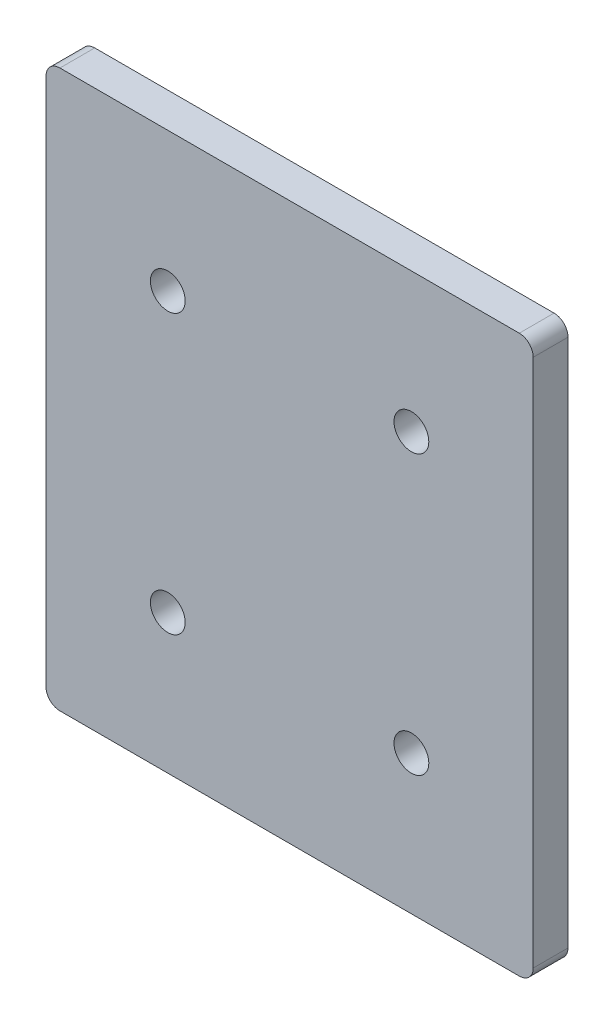
ISO-10303-21;
HEADER;
FILE_DESCRIPTION(('STEP AP214'),'2;1');
FILE_NAME('part.step','',(''),(''),'','','');
FILE_SCHEMA(('AUTOMOTIVE_DESIGN { 1 0 10303 214 1 1 1 1 }'));
ENDSEC;
DATA;
#1=APPLICATION_CONTEXT('core data for automotive mechanical design processes');
#2=APPLICATION_PROTOCOL_DEFINITION('international standard','automotive_design',2000,#1);
#3=PRODUCT_CONTEXT('',#1,'mechanical');
#4=PRODUCT('Part','Part','',(#3));
#5=PRODUCT_RELATED_PRODUCT_CATEGORY('part','',(#4));
#6=PRODUCT_DEFINITION_FORMATION('','',#4);
#7=PRODUCT_DEFINITION_CONTEXT('part definition',#1,'design');
#8=PRODUCT_DEFINITION('design','',#6,#7);
#9=PRODUCT_DEFINITION_SHAPE('','',#8);
#10=(LENGTH_UNIT() NAMED_UNIT(*) SI_UNIT(.MILLI.,.METRE.));
#11=(NAMED_UNIT(*) PLANE_ANGLE_UNIT() SI_UNIT($,.RADIAN.));
#12=(NAMED_UNIT(*) SI_UNIT($,.STERADIAN.) SOLID_ANGLE_UNIT());
#13=UNCERTAINTY_MEASURE_WITH_UNIT(LENGTH_MEASURE(1.E-05),#10,'distance_accuracy_value','');
#14=(GEOMETRIC_REPRESENTATION_CONTEXT(3) GLOBAL_UNCERTAINTY_ASSIGNED_CONTEXT((#13)) GLOBAL_UNIT_ASSIGNED_CONTEXT((#10,
#11,#12)) REPRESENTATION_CONTEXT('',''));
#15=CARTESIAN_POINT('',(0.,0.,0.));
#16=DIRECTION('',(0.,0.,1.));
#17=DIRECTION('',(1.,0.,0.));
#18=AXIS2_PLACEMENT_3D('',#15,#16,#17);
#19=CARTESIAN_POINT('',(0.,0.,5.));
#20=DIRECTION('',(0.,0.,1.));
#21=DIRECTION('',(1.,0.,0.));
#22=AXIS2_PLACEMENT_3D('',#19,#20,#21);
#23=PLANE('',#22);
#24=CARTESIAN_POINT('',(17.5000000000004,-20.,5.));
#25=DIRECTION('',(0.,0.,1.));
#26=DIRECTION('',(1.,0.,0.));
#27=AXIS2_PLACEMENT_3D('',#24,#25,#26);
#28=CIRCLE('',#27,2.5);
#29=CARTESIAN_POINT('',(20.0000000000004,-20.,5.));
#30=VERTEX_POINT('',#29);
#31=EDGE_CURVE('E183',#30,#30,#28,.T.);
#32=ORIENTED_EDGE('',*,*,#31,.F.);
#33=EDGE_LOOP('',(#32));
#34=FACE_BOUND('',#33,.T.);
#35=CARTESIAN_POINT('',(-17.5,20.,5.));
#36=DIRECTION('',(0.,0.,1.));
#37=DIRECTION('',(1.,0.,0.));
#38=AXIS2_PLACEMENT_3D('',#35,#36,#37);
#39=CIRCLE('',#38,2.5);
#40=CARTESIAN_POINT('',(-15.,20.,5.));
#41=VERTEX_POINT('',#40);
#42=EDGE_CURVE('E166',#41,#41,#39,.T.);
#43=ORIENTED_EDGE('',*,*,#42,.F.);
#44=EDGE_LOOP('',(#43));
#45=FACE_BOUND('',#44,.T.);
#46=DIRECTION('',(0.,-1.,0.));
#47=VECTOR('',#46,1.);
#48=CARTESIAN_POINT('',(-35.,40.,5.));
#49=LINE('',#48,#47);
#50=CARTESIAN_POINT('',(-35.,38.,5.));
#51=VERTEX_POINT('',#50);
#52=CARTESIAN_POINT('',(-35.,-38.,5.));
#53=VERTEX_POINT('',#52);
#54=EDGE_CURVE('E170',#51,#53,#49,.T.);
#55=ORIENTED_EDGE('',*,*,#54,.T.);
#56=CARTESIAN_POINT('',(-33.,-38.,5.));
#57=DIRECTION('',(0.,0.,1.));
#58=DIRECTION('',(1.,0.,0.));
#59=AXIS2_PLACEMENT_3D('',#56,#57,#58);
#60=CIRCLE('',#59,2.);
#61=CARTESIAN_POINT('',(-33.,-40.,5.));
#62=VERTEX_POINT('',#61);
#63=EDGE_CURVE('E153',#53,#62,#60,.T.);
#64=ORIENTED_EDGE('',*,*,#63,.T.);
#65=DIRECTION('',(1.,0.,0.));
#66=VECTOR('',#65,1.);
#67=CARTESIAN_POINT('',(-35.,-40.,5.));
#68=LINE('',#67,#66);
#69=CARTESIAN_POINT('',(33.,-40.,5.));
#70=VERTEX_POINT('',#69);
#71=EDGE_CURVE('E124',#62,#70,#68,.T.);
#72=ORIENTED_EDGE('',*,*,#71,.T.);
#73=CARTESIAN_POINT('',(33.,-38.,5.));
#74=DIRECTION('',(0.,0.,1.));
#75=DIRECTION('',(1.,0.,0.));
#76=AXIS2_PLACEMENT_3D('',#73,#74,#75);
#77=CIRCLE('',#76,2.);
#78=CARTESIAN_POINT('',(35.,-38.,5.));
#79=VERTEX_POINT('',#78);
#80=EDGE_CURVE('E151',#70,#79,#77,.T.);
#81=ORIENTED_EDGE('',*,*,#80,.T.);
#82=DIRECTION('',(0.,1.,0.));
#83=VECTOR('',#82,1.);
#84=CARTESIAN_POINT('',(35.,40.,5.));
#85=LINE('',#84,#83);
#86=CARTESIAN_POINT('',(35.,38.,5.));
#87=VERTEX_POINT('',#86);
#88=EDGE_CURVE('E131',#79,#87,#85,.T.);
#89=ORIENTED_EDGE('',*,*,#88,.T.);
#90=CARTESIAN_POINT('',(33.,38.,5.));
#91=DIRECTION('',(0.,0.,1.));
#92=DIRECTION('',(1.,0.,0.));
#93=AXIS2_PLACEMENT_3D('',#90,#91,#92);
#94=CIRCLE('',#93,2.);
#95=CARTESIAN_POINT('',(33.,40.,5.));
#96=VERTEX_POINT('',#95);
#97=EDGE_CURVE('E59',#87,#96,#94,.T.);
#98=ORIENTED_EDGE('',*,*,#97,.T.);
#99=DIRECTION('',(-1.,0.,0.));
#100=VECTOR('',#99,1.);
#101=CARTESIAN_POINT('',(-35.,40.,5.));
#102=LINE('',#101,#100);
#103=CARTESIAN_POINT('',(-33.,40.,5.));
#104=VERTEX_POINT('',#103);
#105=EDGE_CURVE('E134',#96,#104,#102,.T.);
#106=ORIENTED_EDGE('',*,*,#105,.T.);
#107=CARTESIAN_POINT('',(-33.,38.,5.));
#108=DIRECTION('',(0.,0.,1.));
#109=DIRECTION('',(1.,0.,0.));
#110=AXIS2_PLACEMENT_3D('',#107,#108,#109);
#111=CIRCLE('',#110,2.);
#112=EDGE_CURVE('E149',#104,#51,#111,.T.);
#113=ORIENTED_EDGE('',*,*,#112,.T.);
#114=EDGE_LOOP('',(#55,#64,#72,#81,#89,#98,#106,#113));
#115=FACE_BOUND('',#114,.T.);
#116=CARTESIAN_POINT('',(17.5,20.,5.));
#117=DIRECTION('',(0.,0.,1.));
#118=DIRECTION('',(1.,0.,0.));
#119=AXIS2_PLACEMENT_3D('',#116,#117,#118);
#120=CIRCLE('',#119,2.5);
#121=CARTESIAN_POINT('',(20.,20.,5.));
#122=VERTEX_POINT('',#121);
#123=EDGE_CURVE('E177',#122,#122,#120,.T.);
#124=ORIENTED_EDGE('',*,*,#123,.F.);
#125=EDGE_LOOP('',(#124));
#126=FACE_BOUND('',#125,.T.);
#127=CARTESIAN_POINT('',(-17.4999999999996,-20.,5.));
#128=DIRECTION('',(0.,0.,1.));
#129=DIRECTION('',(1.,0.,0.));
#130=AXIS2_PLACEMENT_3D('',#127,#128,#129);
#131=CIRCLE('',#130,2.5);
#132=CARTESIAN_POINT('',(-14.9999999999996,-20.,5.));
#133=VERTEX_POINT('',#132);
#134=EDGE_CURVE('E189',#133,#133,#131,.T.);
#135=ORIENTED_EDGE('',*,*,#134,.F.);
#136=EDGE_LOOP('',(#135));
#137=FACE_BOUND('',#136,.T.);
#138=ADVANCED_FACE('F39',(#34,#45,#115,#126,#137),#23,.T.);
#139=CARTESIAN_POINT('',(0.,0.,0.));
#140=DIRECTION('',(0.,0.,1.));
#141=DIRECTION('',(1.,0.,0.));
#142=AXIS2_PLACEMENT_3D('',#139,#140,#141);
#143=PLANE('',#142);
#144=DIRECTION('',(1.,0.,0.));
#145=VECTOR('',#144,1.);
#146=CARTESIAN_POINT('',(-35.,-40.,0.));
#147=LINE('',#146,#145);
#148=CARTESIAN_POINT('',(-33.,-40.,0.));
#149=VERTEX_POINT('',#148);
#150=CARTESIAN_POINT('',(33.,-40.,0.));
#151=VERTEX_POINT('',#150);
#152=EDGE_CURVE('E121',#149,#151,#147,.T.);
#153=ORIENTED_EDGE('',*,*,#152,.F.);
#154=CARTESIAN_POINT('',(-33.,-38.,0.));
#155=DIRECTION('',(0.,0.,1.));
#156=DIRECTION('',(1.,0.,0.));
#157=AXIS2_PLACEMENT_3D('',#154,#155,#156);
#158=CIRCLE('',#157,2.);
#159=CARTESIAN_POINT('',(-35.,-38.,0.));
#160=VERTEX_POINT('',#159);
#161=EDGE_CURVE('E104',#149,#160,#158,.F.);
#162=ORIENTED_EDGE('',*,*,#161,.T.);
#163=DIRECTION('',(0.,-1.,0.));
#164=VECTOR('',#163,1.);
#165=CARTESIAN_POINT('',(-35.,40.,0.));
#166=LINE('',#165,#164);
#167=CARTESIAN_POINT('',(-35.,38.,0.));
#168=VERTEX_POINT('',#167);
#169=EDGE_CURVE('E132',#168,#160,#166,.T.);
#170=ORIENTED_EDGE('',*,*,#169,.F.);
#171=CARTESIAN_POINT('',(-33.,38.,0.));
#172=DIRECTION('',(0.,0.,1.));
#173=DIRECTION('',(1.,0.,0.));
#174=AXIS2_PLACEMENT_3D('',#171,#172,#173);
#175=CIRCLE('',#174,2.);
#176=CARTESIAN_POINT('',(-33.,40.,0.));
#177=VERTEX_POINT('',#176);
#178=EDGE_CURVE('E142',#168,#177,#175,.F.);
#179=ORIENTED_EDGE('',*,*,#178,.T.);
#180=DIRECTION('',(-1.,0.,0.));
#181=VECTOR('',#180,1.);
#182=CARTESIAN_POINT('',(-35.,40.,0.));
#183=LINE('',#182,#181);
#184=CARTESIAN_POINT('',(33.,40.,0.));
#185=VERTEX_POINT('',#184);
#186=EDGE_CURVE('E136',#185,#177,#183,.T.);
#187=ORIENTED_EDGE('',*,*,#186,.F.);
#188=CARTESIAN_POINT('',(33.,38.,0.));
#189=DIRECTION('',(0.,0.,1.));
#190=DIRECTION('',(1.,0.,0.));
#191=AXIS2_PLACEMENT_3D('',#188,#189,#190);
#192=CIRCLE('',#191,2.);
#193=CARTESIAN_POINT('',(35.,38.,0.));
#194=VERTEX_POINT('',#193);
#195=EDGE_CURVE('E125',#185,#194,#192,.F.);
#196=ORIENTED_EDGE('',*,*,#195,.T.);
#197=DIRECTION('',(0.,1.,0.));
#198=VECTOR('',#197,1.);
#199=CARTESIAN_POINT('',(35.,40.,0.));
#200=LINE('',#199,#198);
#201=CARTESIAN_POINT('',(35.,-38.,0.));
#202=VERTEX_POINT('',#201);
#203=EDGE_CURVE('E165',#202,#194,#200,.T.);
#204=ORIENTED_EDGE('',*,*,#203,.F.);
#205=CARTESIAN_POINT('',(33.,-38.,0.));
#206=DIRECTION('',(0.,0.,1.));
#207=DIRECTION('',(1.,0.,0.));
#208=AXIS2_PLACEMENT_3D('',#205,#206,#207);
#209=CIRCLE('',#208,2.);
#210=EDGE_CURVE('E115',#202,#151,#209,.F.);
#211=ORIENTED_EDGE('',*,*,#210,.T.);
#212=EDGE_LOOP('',(#153,#162,#170,#179,#187,#196,#204,#211));
#213=FACE_BOUND('',#212,.T.);
#214=CARTESIAN_POINT('',(-17.5,20.,0.));
#215=DIRECTION('',(0.,0.,1.));
#216=DIRECTION('',(1.,0.,0.));
#217=AXIS2_PLACEMENT_3D('',#214,#215,#216);
#218=CIRCLE('',#217,2.5);
#219=CARTESIAN_POINT('',(-15.,20.,0.));
#220=VERTEX_POINT('',#219);
#221=EDGE_CURVE('E174',#220,#220,#218,.T.);
#222=ORIENTED_EDGE('',*,*,#221,.T.);
#223=EDGE_LOOP('',(#222));
#224=FACE_BOUND('',#223,.T.);
#225=CARTESIAN_POINT('',(17.5,20.,0.));
#226=DIRECTION('',(0.,0.,1.));
#227=DIRECTION('',(1.,0.,0.));
#228=AXIS2_PLACEMENT_3D('',#225,#226,#227);
#229=CIRCLE('',#228,2.5);
#230=CARTESIAN_POINT('',(20.,20.,0.));
#231=VERTEX_POINT('',#230);
#232=EDGE_CURVE('E180',#231,#231,#229,.T.);
#233=ORIENTED_EDGE('',*,*,#232,.T.);
#234=EDGE_LOOP('',(#233));
#235=FACE_BOUND('',#234,.T.);
#236=CARTESIAN_POINT('',(17.5000000000004,-20.,0.));
#237=DIRECTION('',(0.,0.,1.));
#238=DIRECTION('',(1.,0.,0.));
#239=AXIS2_PLACEMENT_3D('',#236,#237,#238);
#240=CIRCLE('',#239,2.5);
#241=CARTESIAN_POINT('',(20.0000000000004,-20.,0.));
#242=VERTEX_POINT('',#241);
#243=EDGE_CURVE('E186',#242,#242,#240,.T.);
#244=ORIENTED_EDGE('',*,*,#243,.T.);
#245=EDGE_LOOP('',(#244));
#246=FACE_BOUND('',#245,.T.);
#247=CARTESIAN_POINT('',(-17.4999999999996,-20.,0.));
#248=DIRECTION('',(0.,0.,1.));
#249=DIRECTION('',(1.,0.,0.));
#250=AXIS2_PLACEMENT_3D('',#247,#248,#249);
#251=CIRCLE('',#250,2.5);
#252=CARTESIAN_POINT('',(-14.9999999999996,-20.,0.));
#253=VERTEX_POINT('',#252);
#254=EDGE_CURVE('E192',#253,#253,#251,.T.);
#255=ORIENTED_EDGE('',*,*,#254,.T.);
#256=EDGE_LOOP('',(#255));
#257=FACE_BOUND('',#256,.T.);
#258=ADVANCED_FACE('F128',(#213,#224,#235,#246,#257),#143,.F.);
#259=CARTESIAN_POINT('',(35.,40.,5.));
#260=DIRECTION('',(-1.,0.,0.));
#261=DIRECTION('',(0.,-1.,0.));
#262=AXIS2_PLACEMENT_3D('',#259,#260,#261);
#263=PLANE('',#262);
#264=ORIENTED_EDGE('',*,*,#88,.F.);
#265=DIRECTION('',(0.,0.,-1.));
#266=VECTOR('',#265,1.);
#267=CARTESIAN_POINT('',(35.,-38.,5.));
#268=LINE('',#267,#266);
#269=EDGE_CURVE('E157',#79,#202,#268,.T.);
#270=ORIENTED_EDGE('',*,*,#269,.T.);
#271=ORIENTED_EDGE('',*,*,#203,.T.);
#272=DIRECTION('',(0.,0.,-1.));
#273=VECTOR('',#272,1.);
#274=CARTESIAN_POINT('',(35.,38.,5.));
#275=LINE('',#274,#273);
#276=EDGE_CURVE('E155',#194,#87,#275,.F.);
#277=ORIENTED_EDGE('',*,*,#276,.T.);
#278=EDGE_LOOP('',(#264,#270,#271,#277));
#279=FACE_BOUND('',#278,.T.);
#280=ADVANCED_FACE('F207',(#279),#263,.F.);
#281=CARTESIAN_POINT('',(-35.,40.,5.));
#282=DIRECTION('',(0.,-1.,0.));
#283=DIRECTION('',(0.,0.,-1.));
#284=AXIS2_PLACEMENT_3D('',#281,#282,#283);
#285=PLANE('',#284);
#286=ORIENTED_EDGE('',*,*,#186,.T.);
#287=DIRECTION('',(0.,0.,-1.));
#288=VECTOR('',#287,1.);
#289=CARTESIAN_POINT('',(-33.,40.,5.));
#290=LINE('',#289,#288);
#291=EDGE_CURVE('E11',#177,#104,#290,.F.);
#292=ORIENTED_EDGE('',*,*,#291,.T.);
#293=ORIENTED_EDGE('',*,*,#105,.F.);
#294=DIRECTION('',(0.,0.,-1.));
#295=VECTOR('',#294,1.);
#296=CARTESIAN_POINT('',(33.,40.,5.));
#297=LINE('',#296,#295);
#298=EDGE_CURVE('E47',#96,#185,#297,.T.);
#299=ORIENTED_EDGE('',*,*,#298,.T.);
#300=EDGE_LOOP('',(#286,#292,#293,#299));
#301=FACE_BOUND('',#300,.T.);
#302=ADVANCED_FACE('F162',(#301),#285,.F.);
#303=CARTESIAN_POINT('',(-35.,40.,5.));
#304=DIRECTION('',(1.,0.,0.));
#305=DIRECTION('',(0.,1.,0.));
#306=AXIS2_PLACEMENT_3D('',#303,#304,#305);
#307=PLANE('',#306);
#308=ORIENTED_EDGE('',*,*,#169,.T.);
#309=DIRECTION('',(0.,0.,-1.));
#310=VECTOR('',#309,1.);
#311=CARTESIAN_POINT('',(-35.,-38.,5.));
#312=LINE('',#311,#310);
#313=EDGE_CURVE('E109',#160,#53,#312,.F.);
#314=ORIENTED_EDGE('',*,*,#313,.T.);
#315=ORIENTED_EDGE('',*,*,#54,.F.);
#316=DIRECTION('',(0.,0.,-1.));
#317=VECTOR('',#316,1.);
#318=CARTESIAN_POINT('',(-35.,38.,5.));
#319=LINE('',#318,#317);
#320=EDGE_CURVE('E114',#51,#168,#319,.T.);
#321=ORIENTED_EDGE('',*,*,#320,.T.);
#322=EDGE_LOOP('',(#308,#314,#315,#321));
#323=FACE_BOUND('',#322,.T.);
#324=ADVANCED_FACE('F217',(#323),#307,.F.);
#325=CARTESIAN_POINT('',(-35.,-40.,5.));
#326=DIRECTION('',(0.,1.,0.));
#327=DIRECTION('',(0.,0.,1.));
#328=AXIS2_PLACEMENT_3D('',#325,#326,#327);
#329=PLANE('',#328);
#330=ORIENTED_EDGE('',*,*,#71,.F.);
#331=DIRECTION('',(0.,0.,-1.));
#332=VECTOR('',#331,1.);
#333=CARTESIAN_POINT('',(-33.,-40.,5.));
#334=LINE('',#333,#332);
#335=EDGE_CURVE('E108',#62,#149,#334,.T.);
#336=ORIENTED_EDGE('',*,*,#335,.T.);
#337=ORIENTED_EDGE('',*,*,#152,.T.);
#338=DIRECTION('',(0.,0.,-1.));
#339=VECTOR('',#338,1.);
#340=CARTESIAN_POINT('',(33.,-40.,5.));
#341=LINE('',#340,#339);
#342=EDGE_CURVE('E126',#151,#70,#341,.F.);
#343=ORIENTED_EDGE('',*,*,#342,.T.);
#344=EDGE_LOOP('',(#330,#336,#337,#343));
#345=FACE_BOUND('',#344,.T.);
#346=ADVANCED_FACE('F120',(#345),#329,.F.);
#347=CARTESIAN_POINT('',(-17.5,20.,5.));
#348=DIRECTION('',(0.,0.,-1.));
#349=DIRECTION('',(-1.,0.,0.));
#350=AXIS2_PLACEMENT_3D('',#347,#348,#349);
#351=CYLINDRICAL_SURFACE('',#350,2.5);
#352=ORIENTED_EDGE('',*,*,#42,.T.);
#353=EDGE_LOOP('',(#352));
#354=FACE_BOUND('',#353,.T.);
#355=ORIENTED_EDGE('',*,*,#221,.F.);
#356=EDGE_LOOP('',(#355));
#357=FACE_BOUND('',#356,.T.);
#358=ADVANCED_FACE('F212',(#354,#357),#351,.F.);
#359=CARTESIAN_POINT('',(17.5,20.,5.));
#360=DIRECTION('',(0.,0.,-1.));
#361=DIRECTION('',(-1.,0.,0.));
#362=AXIS2_PLACEMENT_3D('',#359,#360,#361);
#363=CYLINDRICAL_SURFACE('',#362,2.5);
#364=ORIENTED_EDGE('',*,*,#123,.T.);
#365=EDGE_LOOP('',(#364));
#366=FACE_BOUND('',#365,.T.);
#367=ORIENTED_EDGE('',*,*,#232,.F.);
#368=EDGE_LOOP('',(#367));
#369=FACE_BOUND('',#368,.T.);
#370=ADVANCED_FACE('F247',(#366,#369),#363,.F.);
#371=CARTESIAN_POINT('',(17.5000000000004,-20.,5.));
#372=DIRECTION('',(0.,0.,-1.));
#373=DIRECTION('',(-1.,0.,0.));
#374=AXIS2_PLACEMENT_3D('',#371,#372,#373);
#375=CYLINDRICAL_SURFACE('',#374,2.5);
#376=ORIENTED_EDGE('',*,*,#31,.T.);
#377=EDGE_LOOP('',(#376));
#378=FACE_BOUND('',#377,.T.);
#379=ORIENTED_EDGE('',*,*,#243,.F.);
#380=EDGE_LOOP('',(#379));
#381=FACE_BOUND('',#380,.T.);
#382=ADVANCED_FACE('F250',(#378,#381),#375,.F.);
#383=CARTESIAN_POINT('',(-17.4999999999996,-20.,5.));
#384=DIRECTION('',(0.,0.,-1.));
#385=DIRECTION('',(-1.,0.,0.));
#386=AXIS2_PLACEMENT_3D('',#383,#384,#385);
#387=CYLINDRICAL_SURFACE('',#386,2.5);
#388=ORIENTED_EDGE('',*,*,#134,.T.);
#389=EDGE_LOOP('',(#388));
#390=FACE_BOUND('',#389,.T.);
#391=ORIENTED_EDGE('',*,*,#254,.F.);
#392=EDGE_LOOP('',(#391));
#393=FACE_BOUND('',#392,.T.);
#394=ADVANCED_FACE('F198',(#390,#393),#387,.F.);
#395=CARTESIAN_POINT('',(-33.,-38.,5.));
#396=DIRECTION('',(0.,0.,-1.));
#397=DIRECTION('',(-1.,0.,0.));
#398=AXIS2_PLACEMENT_3D('',#395,#396,#397);
#399=CYLINDRICAL_SURFACE('',#398,2.);
#400=ORIENTED_EDGE('',*,*,#63,.F.);
#401=ORIENTED_EDGE('',*,*,#313,.F.);
#402=ORIENTED_EDGE('',*,*,#161,.F.);
#403=ORIENTED_EDGE('',*,*,#335,.F.);
#404=EDGE_LOOP('',(#400,#401,#402,#403));
#405=FACE_BOUND('',#404,.T.);
#406=ADVANCED_FACE('F107',(#405),#399,.T.);
#407=CARTESIAN_POINT('',(33.,-38.,5.));
#408=DIRECTION('',(0.,0.,-1.));
#409=DIRECTION('',(-1.,0.,0.));
#410=AXIS2_PLACEMENT_3D('',#407,#408,#409);
#411=CYLINDRICAL_SURFACE('',#410,2.);
#412=ORIENTED_EDGE('',*,*,#80,.F.);
#413=ORIENTED_EDGE('',*,*,#342,.F.);
#414=ORIENTED_EDGE('',*,*,#210,.F.);
#415=ORIENTED_EDGE('',*,*,#269,.F.);
#416=EDGE_LOOP('',(#412,#413,#414,#415));
#417=FACE_BOUND('',#416,.T.);
#418=ADVANCED_FACE('F228',(#417),#411,.T.);
#419=CARTESIAN_POINT('',(-33.,38.,5.));
#420=DIRECTION('',(0.,0.,-1.));
#421=DIRECTION('',(-1.,0.,0.));
#422=AXIS2_PLACEMENT_3D('',#419,#420,#421);
#423=CYLINDRICAL_SURFACE('',#422,2.);
#424=ORIENTED_EDGE('',*,*,#112,.F.);
#425=ORIENTED_EDGE('',*,*,#291,.F.);
#426=ORIENTED_EDGE('',*,*,#178,.F.);
#427=ORIENTED_EDGE('',*,*,#320,.F.);
#428=EDGE_LOOP('',(#424,#425,#426,#427));
#429=FACE_BOUND('',#428,.T.);
#430=ADVANCED_FACE('F230',(#429),#423,.T.);
#431=CARTESIAN_POINT('',(33.,38.,5.));
#432=DIRECTION('',(0.,0.,-1.));
#433=DIRECTION('',(-1.,0.,0.));
#434=AXIS2_PLACEMENT_3D('',#431,#432,#433);
#435=CYLINDRICAL_SURFACE('',#434,2.);
#436=ORIENTED_EDGE('',*,*,#97,.F.);
#437=ORIENTED_EDGE('',*,*,#276,.F.);
#438=ORIENTED_EDGE('',*,*,#195,.F.);
#439=ORIENTED_EDGE('',*,*,#298,.F.);
#440=EDGE_LOOP('',(#436,#437,#438,#439));
#441=FACE_BOUND('',#440,.T.);
#442=ADVANCED_FACE('F41',(#441),#435,.T.);
#443=CLOSED_SHELL('',(#138,#258,#280,#302,#324,#346,#358,#370,#382,#394,#406,#418,#430,#442));
#444=MANIFOLD_SOLID_BREP('B2',#443);
#445=ADVANCED_BREP_SHAPE_REPRESENTATION('',(#18,#444),#14);
#446=SHAPE_DEFINITION_REPRESENTATION(#9,#445);
ENDSEC;
END-ISO-10303-21;
